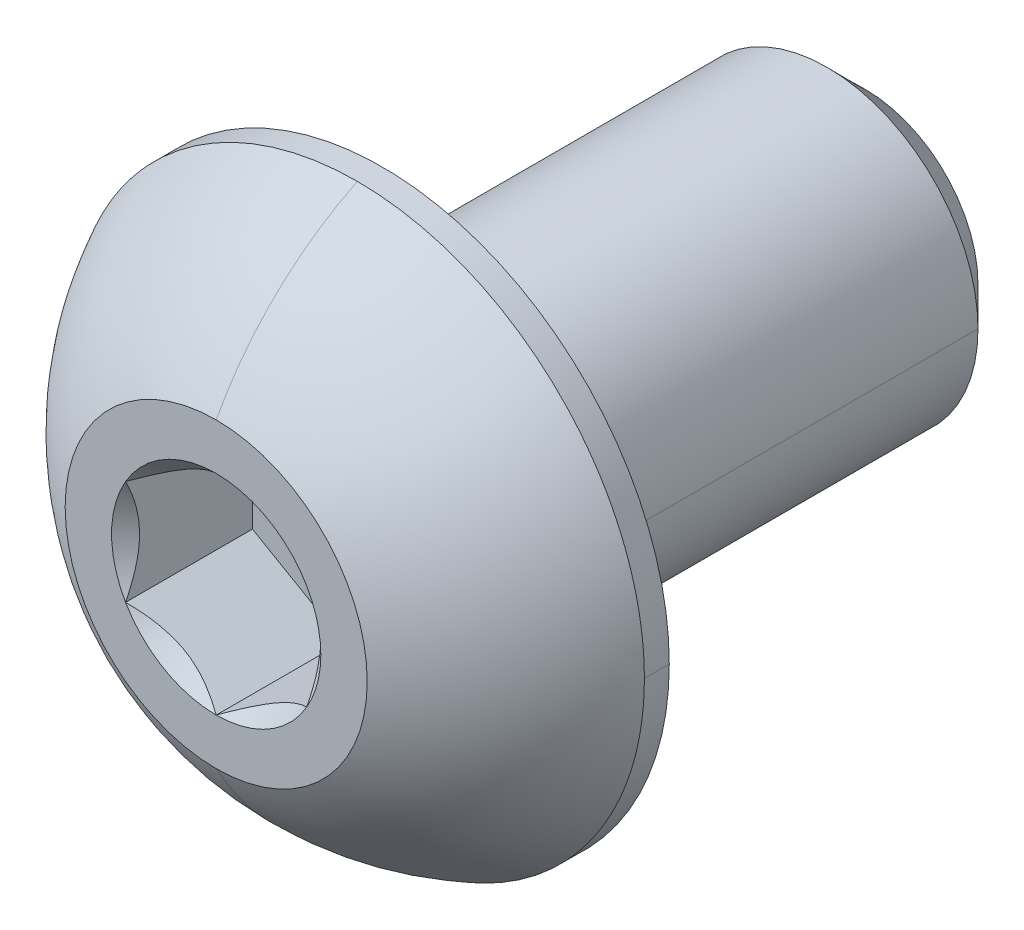
ISO-10303-21;
HEADER;
FILE_DESCRIPTION(('STEP AP214'),'2;1');
FILE_NAME('part.step','',(''),(''),'','','');
FILE_SCHEMA(('AUTOMOTIVE_DESIGN { 1 0 10303 214 1 1 1 1 }'));
ENDSEC;
DATA;
#1=APPLICATION_CONTEXT('core data for automotive mechanical design processes');
#2=APPLICATION_PROTOCOL_DEFINITION('international standard','automotive_design',2000,#1);
#3=PRODUCT_CONTEXT('',#1,'mechanical');
#4=PRODUCT('Part','Part','',(#3));
#5=PRODUCT_RELATED_PRODUCT_CATEGORY('part','',(#4));
#6=PRODUCT_DEFINITION_FORMATION('','',#4);
#7=PRODUCT_DEFINITION_CONTEXT('part definition',#1,'design');
#8=PRODUCT_DEFINITION('design','',#6,#7);
#9=PRODUCT_DEFINITION_SHAPE('','',#8);
#10=(LENGTH_UNIT() NAMED_UNIT(*) SI_UNIT(.MILLI.,.METRE.));
#11=(NAMED_UNIT(*) PLANE_ANGLE_UNIT() SI_UNIT($,.RADIAN.));
#12=(NAMED_UNIT(*) SI_UNIT($,.STERADIAN.) SOLID_ANGLE_UNIT());
#13=UNCERTAINTY_MEASURE_WITH_UNIT(LENGTH_MEASURE(1.E-05),#10,'distance_accuracy_value','');
#14=(GEOMETRIC_REPRESENTATION_CONTEXT(3) GLOBAL_UNCERTAINTY_ASSIGNED_CONTEXT((#13)) GLOBAL_UNIT_ASSIGNED_CONTEXT((#10,
#11,#12)) REPRESENTATION_CONTEXT('',''));
#15=CARTESIAN_POINT('',(0.,0.,0.));
#16=DIRECTION('',(0.,0.,1.));
#17=DIRECTION('',(1.,0.,0.));
#18=AXIS2_PLACEMENT_3D('',#15,#16,#17);
#19=CARTESIAN_POINT('',(1.5,0.866025403784439,3.275));
#20=DIRECTION('',(0.5,0.866025403784439,0.));
#21=DIRECTION('',(0.,0.,-1.));
#22=AXIS2_PLACEMENT_3D('',#19,#20,#21);
#23=PLANE('',#22);
#24=DIRECTION('',(0.,0.,1.));
#25=VECTOR('',#24,1.);
#26=CARTESIAN_POINT('',(1.5,0.866025403784439,3.275));
#27=LINE('',#26,#25);
#28=CARTESIAN_POINT('',(1.5,0.866025403784439,3.275));
#29=VERTEX_POINT('',#28);
#30=CARTESIAN_POINT('',(1.5,0.866025403784439,5.375));
#31=VERTEX_POINT('',#30);
#32=EDGE_CURVE('E10',#29,#31,#27,.T.);
#33=ORIENTED_EDGE('',*,*,#32,.T.);
#34=CARTESIAN_POINT('',(1.5,0.866025403784439,5.375));
#35=CARTESIAN_POINT('',(1.09983313244963,1.09706185248541,5.14396355129903));
#36=CARTESIAN_POINT('',(0.752762837135629,1.29744298091268,5.14295258499126));
#37=CARTESIAN_POINT('',(0.40367911573999,1.49898656143016,5.14193575386027));
#38=CARTESIAN_POINT('',(0.,1.73205080756888,5.375));
#39=B_SPLINE_CURVE_WITH_KNOTS('',2,(#34,#35,#36,#37,#38),.UNSPECIFIED.,.F.,.F.,(3,2,3),(0.,0.5,
1.),.UNSPECIFIED.);
#40=CARTESIAN_POINT('',(0.,1.73205080756888,5.375));
#41=VERTEX_POINT('',#40);
#42=EDGE_CURVE('E265',#31,#41,#39,.T.);
#43=ORIENTED_EDGE('',*,*,#42,.T.);
#44=DIRECTION('',(0.,0.,1.));
#45=VECTOR('',#44,1.);
#46=CARTESIAN_POINT('',(0.,1.73205080756888,3.275));
#47=LINE('',#46,#45);
#48=CARTESIAN_POINT('',(0.,1.73205080756888,3.275));
#49=VERTEX_POINT('',#48);
#50=EDGE_CURVE('E248',#49,#41,#47,.T.);
#51=ORIENTED_EDGE('',*,*,#50,.F.);
#52=DIRECTION('',(-0.866025403784439,0.5,0.));
#53=VECTOR('',#52,1.);
#54=CARTESIAN_POINT('',(1.5,0.866025403784439,3.275));
#55=LINE('',#54,#53);
#56=EDGE_CURVE('E261',#29,#49,#55,.T.);
#57=ORIENTED_EDGE('',*,*,#56,.F.);
#58=EDGE_LOOP('',(#33,#43,#51,#57));
#59=FACE_BOUND('',#58,.T.);
#60=ADVANCED_FACE('F16',(#59),#23,.F.);
#61=CARTESIAN_POINT('',(1.5,-0.866025403784439,3.275));
#62=DIRECTION('',(1.,0.,0.));
#63=DIRECTION('',(0.,-1.,0.));
#64=AXIS2_PLACEMENT_3D('',#61,#62,#63);
#65=PLANE('',#64);
#66=DIRECTION('',(0.,0.,1.));
#67=VECTOR('',#66,1.);
#68=CARTESIAN_POINT('',(1.5,-0.866025403784439,3.275));
#69=LINE('',#68,#67);
#70=CARTESIAN_POINT('',(1.5,-0.866025403784439,3.275));
#71=VERTEX_POINT('',#70);
#72=CARTESIAN_POINT('',(1.5,-0.866025403784439,5.375));
#73=VERTEX_POINT('',#72);
#74=EDGE_CURVE('E28',#71,#73,#69,.T.);
#75=ORIENTED_EDGE('',*,*,#74,.T.);
#76=CARTESIAN_POINT('',(1.5,-0.86602540378444,5.375));
#77=CARTESIAN_POINT('',(1.5,-0.646658602548751,5.26531659938216));
#78=CARTESIAN_POINT('',(1.5,-0.445863993413875,5.20781171055308));
#79=CARTESIAN_POINT('',(1.5,-0.219378137358918,5.14294919243113));
#80=CARTESIAN_POINT('',(1.5,0.,5.14294919243113));
#81=B_SPLINE_CURVE_WITH_KNOTS('',2,(#76,#77,#78,#79,#80),.UNSPECIFIED.,.F.,.F.,(3,2,3),(0.,0.5,
1.),.UNSPECIFIED.);
#82=CARTESIAN_POINT('',(1.5,0.,5.14294919243113));
#83=VERTEX_POINT('',#82);
#84=EDGE_CURVE('E450',#73,#83,#81,.T.);
#85=ORIENTED_EDGE('',*,*,#84,.T.);
#86=CARTESIAN_POINT('',(1.5,0.,5.14294919243113));
#87=CARTESIAN_POINT('',(1.5,0.217075978680325,5.14294919243113));
#88=CARTESIAN_POINT('',(1.5,0.445959967478607,5.20783905839392));
#89=CARTESIAN_POINT('',(1.5,0.643987045881716,5.26398082104864));
#90=CARTESIAN_POINT('',(1.5,0.866025403784441,5.375));
#91=B_SPLINE_CURVE_WITH_KNOTS('',2,(#86,#87,#88,#89,#90),.UNSPECIFIED.,.F.,.F.,(3,2,3),(0.,0.5,
1.),.UNSPECIFIED.);
#92=EDGE_CURVE('E423',#83,#31,#91,.T.);
#93=ORIENTED_EDGE('',*,*,#92,.T.);
#94=ORIENTED_EDGE('',*,*,#32,.F.);
#95=DIRECTION('',(0.,1.,0.));
#96=VECTOR('',#95,1.);
#97=CARTESIAN_POINT('',(1.5,-0.866025403784439,3.275));
#98=LINE('',#97,#96);
#99=EDGE_CURVE('E244',#71,#29,#98,.T.);
#100=ORIENTED_EDGE('',*,*,#99,.F.);
#101=EDGE_LOOP('',(#75,#85,#93,#94,#100));
#102=FACE_BOUND('',#101,.T.);
#103=ADVANCED_FACE('F404',(#102),#65,.F.);
#104=CARTESIAN_POINT('',(0.,-1.73205080756887,3.275));
#105=DIRECTION('',(0.5,-0.866025403784439,0.));
#106=DIRECTION('',(0.,0.,-1.));
#107=AXIS2_PLACEMENT_3D('',#104,#105,#106);
#108=PLANE('',#107);
#109=DIRECTION('',(0.,0.,1.));
#110=VECTOR('',#109,1.);
#111=CARTESIAN_POINT('',(0.,-1.73205080756887,3.275));
#112=LINE('',#111,#110);
#113=CARTESIAN_POINT('',(0.,-1.73205080756887,3.275));
#114=VERTEX_POINT('',#113);
#115=CARTESIAN_POINT('',(0.,-1.73205080756888,5.375));
#116=VERTEX_POINT('',#115);
#117=EDGE_CURVE('E52',#114,#116,#112,.T.);
#118=ORIENTED_EDGE('',*,*,#117,.T.);
#119=CARTESIAN_POINT('',(0.,-1.73205080756887,5.375));
#120=CARTESIAN_POINT('',(0.4001668675493,-1.50101435886852,5.14396355129965));
#121=CARTESIAN_POINT('',(0.74723716286437,-1.30063323044064,5.14295258499126));
#122=CARTESIAN_POINT('',(1.09632088425894,-1.09908964992377,5.14193575385965));
#123=CARTESIAN_POINT('',(1.5,-0.866025403784437,5.375));
#124=B_SPLINE_CURVE_WITH_KNOTS('',2,(#119,#120,#121,#122,#123),.UNSPECIFIED.,.F.,.F.,(3,2,3),
(0.,0.5,1.),.UNSPECIFIED.);
#125=EDGE_CURVE('E415',#116,#73,#124,.T.);
#126=ORIENTED_EDGE('',*,*,#125,.T.);
#127=ORIENTED_EDGE('',*,*,#74,.F.);
#128=DIRECTION('',(0.866025403784439,0.5,0.));
#129=VECTOR('',#128,1.);
#130=CARTESIAN_POINT('',(0.,-1.73205080756887,3.275));
#131=LINE('',#130,#129);
#132=EDGE_CURVE('E249',#114,#71,#131,.T.);
#133=ORIENTED_EDGE('',*,*,#132,.F.);
#134=EDGE_LOOP('',(#118,#126,#127,#133));
#135=FACE_BOUND('',#134,.T.);
#136=ADVANCED_FACE('F401',(#135),#108,.F.);
#137=CARTESIAN_POINT('',(-1.5,-0.866025403784438,3.275));
#138=DIRECTION('',(-0.5,-0.866025403784439,0.));
#139=DIRECTION('',(-0.866025403784439,0.5,0.));
#140=AXIS2_PLACEMENT_3D('',#137,#138,#139);
#141=PLANE('',#140);
#142=DIRECTION('',(0.,0.,1.));
#143=VECTOR('',#142,1.);
#144=CARTESIAN_POINT('',(-1.5,-0.866025403784438,3.275));
#145=LINE('',#144,#143);
#146=CARTESIAN_POINT('',(-1.5,-0.866025403784438,3.275));
#147=VERTEX_POINT('',#146);
#148=CARTESIAN_POINT('',(-1.5,-0.866025403784439,5.375));
#149=VERTEX_POINT('',#148);
#150=EDGE_CURVE('E376',#147,#149,#145,.T.);
#151=ORIENTED_EDGE('',*,*,#150,.T.);
#152=CARTESIAN_POINT('',(-1.5,-0.866025403784438,5.375));
#153=CARTESIAN_POINT('',(-1.09983313245018,-1.0970618524851,5.14396355129934));
#154=CARTESIAN_POINT('',(-0.752762837135629,-1.29744298091268,5.14295258499127));
#155=CARTESIAN_POINT('',(-0.403679115740522,-1.49898656142986,5.14193575385996));
#156=CARTESIAN_POINT('',(0.,-1.73205080756888,5.375));
#157=B_SPLINE_CURVE_WITH_KNOTS('',2,(#152,#153,#154,#155,#156),.UNSPECIFIED.,.F.,.F.,(3,2,3),
(0.,0.5,1.),.UNSPECIFIED.);
#158=EDGE_CURVE('E387',#149,#116,#157,.T.);
#159=ORIENTED_EDGE('',*,*,#158,.T.);
#160=ORIENTED_EDGE('',*,*,#117,.F.);
#161=DIRECTION('',(0.866025403784439,-0.5,0.));
#162=VECTOR('',#161,1.);
#163=CARTESIAN_POINT('',(-1.5,-0.866025403784438,3.275));
#164=LINE('',#163,#162);
#165=EDGE_CURVE('E254',#147,#114,#164,.T.);
#166=ORIENTED_EDGE('',*,*,#165,.F.);
#167=EDGE_LOOP('',(#151,#159,#160,#166));
#168=FACE_BOUND('',#167,.T.);
#169=ADVANCED_FACE('F392',(#168),#141,.F.);
#170=CARTESIAN_POINT('',(-1.5,0.866025403784439,3.275));
#171=DIRECTION('',(-1.,0.,0.));
#172=DIRECTION('',(0.,0.,1.));
#173=AXIS2_PLACEMENT_3D('',#170,#171,#172);
#174=PLANE('',#173);
#175=DIRECTION('',(0.,0.,1.));
#176=VECTOR('',#175,1.);
#177=CARTESIAN_POINT('',(-1.5,0.866025403784439,3.275));
#178=LINE('',#177,#176);
#179=CARTESIAN_POINT('',(-1.5,0.866025403784439,3.275));
#180=VERTEX_POINT('',#179);
#181=CARTESIAN_POINT('',(-1.5,0.866025403784439,5.375));
#182=VERTEX_POINT('',#181);
#183=EDGE_CURVE('E470',#180,#182,#178,.T.);
#184=ORIENTED_EDGE('',*,*,#183,.T.);
#185=CARTESIAN_POINT('',(-1.5,0.866025403784439,5.375));
#186=CARTESIAN_POINT('',(-1.5,0.645653699099227,5.2648141476574));
#187=CARTESIAN_POINT('',(-1.5,0.446004889099508,5.20785186068247));
#188=CARTESIAN_POINT('',(-1.5,0.218857206002137,5.14304380342282));
#189=CARTESIAN_POINT('',(-1.5,9.44212914030925E-05,5.14294919540291));
#190=CARTESIAN_POINT('',(-1.5,-0.217614156110549,5.1428550432945));
#191=CARTESIAN_POINT('',(-1.5,-0.445819185272561,5.20779894431054));
#192=CARTESIAN_POINT('',(-1.5,-0.644979895375046,5.2644772457953));
#193=CARTESIAN_POINT('',(-1.5,-0.866025403784441,5.375));
#194=B_SPLINE_CURVE_WITH_KNOTS('',2,(#185,#186,#187,#188,#189,#190,#191,#192,#193),
.UNSPECIFIED.,.F.,.F.,(3,2,2,2,3),(0.,0.25,0.5,0.75,1.),.UNSPECIFIED.);
#195=EDGE_CURVE('E504',#182,#149,#194,.T.);
#196=ORIENTED_EDGE('',*,*,#195,.T.);
#197=ORIENTED_EDGE('',*,*,#150,.F.);
#198=DIRECTION('',(0.,-1.,0.));
#199=VECTOR('',#198,1.);
#200=CARTESIAN_POINT('',(-1.5,0.866025403784439,3.275));
#201=LINE('',#200,#199);
#202=EDGE_CURVE('E250',#180,#147,#201,.T.);
#203=ORIENTED_EDGE('',*,*,#202,.F.);
#204=EDGE_LOOP('',(#184,#196,#197,#203));
#205=FACE_BOUND('',#204,.T.);
#206=ADVANCED_FACE('F317',(#205),#174,.F.);
#207=CARTESIAN_POINT('',(0.,1.73205080756888,3.275));
#208=DIRECTION('',(-0.5,0.866025403784439,0.));
#209=DIRECTION('',(0.,0.,1.));
#210=AXIS2_PLACEMENT_3D('',#207,#208,#209);
#211=PLANE('',#210);
#212=ORIENTED_EDGE('',*,*,#50,.T.);
#213=CARTESIAN_POINT('',(0.,1.73205080756888,5.375));
#214=CARTESIAN_POINT('',(-0.400166867550903,1.5010143588676,5.14396355129872));
#215=CARTESIAN_POINT('',(-0.747237162864371,1.30063323044064,5.14295258499126));
#216=CARTESIAN_POINT('',(-1.09632088426054,1.09908964992285,5.14193575386057));
#217=CARTESIAN_POINT('',(-1.5,0.866025403784442,5.375));
#218=B_SPLINE_CURVE_WITH_KNOTS('',2,(#213,#214,#215,#216,#217),.UNSPECIFIED.,.F.,.F.,(3,2,3),
(0.,0.5,1.),.UNSPECIFIED.);
#219=EDGE_CURVE('E219',#41,#182,#218,.T.);
#220=ORIENTED_EDGE('',*,*,#219,.T.);
#221=ORIENTED_EDGE('',*,*,#183,.F.);
#222=DIRECTION('',(-0.866025403784439,-0.5,0.));
#223=VECTOR('',#222,1.);
#224=CARTESIAN_POINT('',(0.,1.73205080756888,3.275));
#225=LINE('',#224,#223);
#226=EDGE_CURVE('E255',#49,#180,#225,.T.);
#227=ORIENTED_EDGE('',*,*,#226,.F.);
#228=EDGE_LOOP('',(#212,#220,#221,#227));
#229=FACE_BOUND('',#228,.T.);
#230=ADVANCED_FACE('F312',(#229),#211,.F.);
#231=CARTESIAN_POINT('',(0.,0.,3.275));
#232=DIRECTION('',(0.,0.,1.));
#233=DIRECTION('',(1.,0.,0.));
#234=AXIS2_PLACEMENT_3D('',#231,#232,#233);
#235=PLANE('',#234);
#236=ORIENTED_EDGE('',*,*,#56,.T.);
#237=ORIENTED_EDGE('',*,*,#226,.T.);
#238=ORIENTED_EDGE('',*,*,#202,.T.);
#239=ORIENTED_EDGE('',*,*,#165,.T.);
#240=ORIENTED_EDGE('',*,*,#132,.T.);
#241=ORIENTED_EDGE('',*,*,#99,.T.);
#242=EDGE_LOOP('',(#236,#237,#238,#239,#240,#241));
#243=FACE_BOUND('',#242,.T.);
#244=ADVANCED_FACE('F307',(#243),#235,.T.);
#245=CARTESIAN_POINT('',(0.,0.,5.375));
#246=DIRECTION('',(0.,0.,1.));
#247=DIRECTION('',(1.,0.,0.));
#248=AXIS2_PLACEMENT_3D('',#245,#246,#247);
#249=CONICAL_SURFACE('',#248,1.73205080756888,0.78539816339745);
#250=CARTESIAN_POINT('',(0.,0.,5.375));
#251=DIRECTION('',(0.,0.,1.));
#252=DIRECTION('',(1.,0.,0.));
#253=AXIS2_PLACEMENT_3D('',#250,#251,#252);
#254=CIRCLE('',#253,1.73205080756888);
#255=EDGE_CURVE('E429',#31,#41,#254,.T.);
#256=ORIENTED_EDGE('',*,*,#255,.T.);
#257=ORIENTED_EDGE('',*,*,#42,.F.);
#258=EDGE_LOOP('',(#256,#257));
#259=FACE_BOUND('',#258,.T.);
#260=ADVANCED_FACE('F296',(#259),#249,.F.);
#261=CARTESIAN_POINT('',(0.,0.,5.375));
#262=DIRECTION('',(0.,0.,1.));
#263=DIRECTION('',(1.,0.,0.));
#264=AXIS2_PLACEMENT_3D('',#261,#262,#263);
#265=CONICAL_SURFACE('',#264,1.73205080756888,0.78539816339745);
#266=DIRECTION('',(0.707106781186549,0.,0.707106781186546));
#267=VECTOR('',#266,1.);
#268=CARTESIAN_POINT('',(1.73205080756888,0.,5.375));
#269=LINE('',#268,#267);
#270=CARTESIAN_POINT('',(1.73205080756888,0.,5.375));
#271=VERTEX_POINT('',#270);
#272=EDGE_CURVE('E419',#83,#271,#269,.T.);
#273=ORIENTED_EDGE('',*,*,#272,.F.);
#274=ORIENTED_EDGE('',*,*,#84,.F.);
#275=CARTESIAN_POINT('',(0.,0.,5.375));
#276=DIRECTION('',(0.,0.,1.));
#277=DIRECTION('',(1.,0.,0.));
#278=AXIS2_PLACEMENT_3D('',#275,#276,#277);
#279=CIRCLE('',#278,1.73205080756888);
#280=EDGE_CURVE('E426',#73,#271,#279,.T.);
#281=ORIENTED_EDGE('',*,*,#280,.T.);
#282=EDGE_LOOP('',(#273,#274,#281));
#283=FACE_BOUND('',#282,.T.);
#284=ADVANCED_FACE('F306',(#283),#265,.F.);
#285=CARTESIAN_POINT('',(0.,0.,5.375));
#286=DIRECTION('',(0.,0.,1.));
#287=DIRECTION('',(1.,0.,0.));
#288=AXIS2_PLACEMENT_3D('',#285,#286,#287);
#289=CONICAL_SURFACE('',#288,1.73205080756888,0.78539816339745);
#290=CARTESIAN_POINT('',(0.,0.,5.375));
#291=DIRECTION('',(0.,0.,1.));
#292=DIRECTION('',(1.,0.,0.));
#293=AXIS2_PLACEMENT_3D('',#290,#291,#292);
#294=CIRCLE('',#293,1.73205080756888);
#295=EDGE_CURVE('E382',#116,#73,#294,.T.);
#296=ORIENTED_EDGE('',*,*,#295,.T.);
#297=ORIENTED_EDGE('',*,*,#125,.F.);
#298=EDGE_LOOP('',(#296,#297));
#299=FACE_BOUND('',#298,.T.);
#300=ADVANCED_FACE('F355',(#299),#289,.F.);
#301=CARTESIAN_POINT('',(0.,0.,5.375));
#302=DIRECTION('',(0.,0.,1.));
#303=DIRECTION('',(1.,0.,0.));
#304=AXIS2_PLACEMENT_3D('',#301,#302,#303);
#305=CONICAL_SURFACE('',#304,1.73205080756888,0.78539816339745);
#306=CARTESIAN_POINT('',(0.,0.,5.375));
#307=DIRECTION('',(0.,0.,1.));
#308=DIRECTION('',(1.,0.,0.));
#309=AXIS2_PLACEMENT_3D('',#306,#307,#308);
#310=CIRCLE('',#309,1.73205080756888);
#311=EDGE_CURVE('E257',#149,#116,#310,.T.);
#312=ORIENTED_EDGE('',*,*,#311,.T.);
#313=ORIENTED_EDGE('',*,*,#158,.F.);
#314=EDGE_LOOP('',(#312,#313));
#315=FACE_BOUND('',#314,.T.);
#316=ADVANCED_FACE('F359',(#315),#305,.F.);
#317=CARTESIAN_POINT('',(0.,0.,5.375));
#318=DIRECTION('',(0.,0.,1.));
#319=DIRECTION('',(1.,0.,0.));
#320=AXIS2_PLACEMENT_3D('',#317,#318,#319);
#321=CONICAL_SURFACE('',#320,1.73205080756888,0.78539816339745);
#322=CARTESIAN_POINT('',(0.,0.,5.375));
#323=DIRECTION('',(0.,0.,1.));
#324=DIRECTION('',(1.,0.,0.));
#325=AXIS2_PLACEMENT_3D('',#322,#323,#324);
#326=CIRCLE('',#325,1.73205080756888);
#327=EDGE_CURVE('E243',#182,#149,#326,.T.);
#328=ORIENTED_EDGE('',*,*,#327,.T.);
#329=ORIENTED_EDGE('',*,*,#195,.F.);
#330=EDGE_LOOP('',(#328,#329));
#331=FACE_BOUND('',#330,.T.);
#332=ADVANCED_FACE('F353',(#331),#321,.F.);
#333=CARTESIAN_POINT('',(0.,0.,5.375));
#334=DIRECTION('',(0.,0.,1.));
#335=DIRECTION('',(1.,0.,0.));
#336=AXIS2_PLACEMENT_3D('',#333,#334,#335);
#337=CONICAL_SURFACE('',#336,1.73205080756888,0.78539816339745);
#338=CARTESIAN_POINT('',(0.,0.,5.375));
#339=DIRECTION('',(0.,0.,1.));
#340=DIRECTION('',(1.,0.,0.));
#341=AXIS2_PLACEMENT_3D('',#338,#339,#340);
#342=CIRCLE('',#341,1.73205080756888);
#343=EDGE_CURVE('E463',#41,#182,#342,.T.);
#344=ORIENTED_EDGE('',*,*,#343,.T.);
#345=ORIENTED_EDGE('',*,*,#219,.F.);
#346=EDGE_LOOP('',(#344,#345));
#347=FACE_BOUND('',#346,.T.);
#348=ADVANCED_FACE('F342',(#347),#337,.F.);
#349=CARTESIAN_POINT('',(0.,0.,-5.375));
#350=DIRECTION('',(0.,0.,1.));
#351=DIRECTION('',(1.,0.,0.));
#352=AXIS2_PLACEMENT_3D('',#349,#350,#351);
#353=PLANE('',#352);
#354=CARTESIAN_POINT('',(0.,0.,-5.375));
#355=DIRECTION('',(0.,0.,1.));
#356=DIRECTION('',(1.,0.,0.));
#357=AXIS2_PLACEMENT_3D('',#354,#355,#356);
#358=CIRCLE('',#357,1.86);
#359=CARTESIAN_POINT('',(1.86,0.,-5.375));
#360=VERTEX_POINT('',#359);
#361=CARTESIAN_POINT('',(-1.86,0.,-5.375));
#362=VERTEX_POINT('',#361);
#363=EDGE_CURVE('E196',#360,#362,#358,.T.);
#364=ORIENTED_EDGE('',*,*,#363,.F.);
#365=CARTESIAN_POINT('',(0.,0.,-5.375));
#366=DIRECTION('',(0.,0.,1.));
#367=DIRECTION('',(1.,0.,0.));
#368=AXIS2_PLACEMENT_3D('',#365,#366,#367);
#369=CIRCLE('',#368,1.86);
#370=EDGE_CURVE('E216',#362,#360,#369,.T.);
#371=ORIENTED_EDGE('',*,*,#370,.F.);
#372=EDGE_LOOP('',(#364,#371));
#373=FACE_BOUND('',#372,.T.);
#374=ADVANCED_FACE('F352',(#373),#353,.F.);
#375=CARTESIAN_POINT('',(0.,0.,-5.375));
#376=DIRECTION('',(0.,0.,1.));
#377=DIRECTION('',(1.,0.,0.));
#378=AXIS2_PLACEMENT_3D('',#375,#376,#377);
#379=CONICAL_SURFACE('',#378,1.86,0.785398163397442);
#380=DIRECTION('',(-0.707106781186544,0.,0.707106781186552));
#381=VECTOR('',#380,1.);
#382=CARTESIAN_POINT('',(-1.86,0.,-5.375));
#383=LINE('',#382,#381);
#384=CARTESIAN_POINT('',(-2.5,0.,-4.735));
#385=VERTEX_POINT('',#384);
#386=EDGE_CURVE('E199',#362,#385,#383,.T.);
#387=ORIENTED_EDGE('',*,*,#386,.F.);
#388=ORIENTED_EDGE('',*,*,#370,.T.);
#389=DIRECTION('',(0.707106781186544,0.,0.707106781186552));
#390=VECTOR('',#389,1.);
#391=CARTESIAN_POINT('',(1.86,0.,-5.375));
#392=LINE('',#391,#390);
#393=CARTESIAN_POINT('',(2.5,0.,-4.735));
#394=VERTEX_POINT('',#393);
#395=EDGE_CURVE('E194',#360,#394,#392,.T.);
#396=ORIENTED_EDGE('',*,*,#395,.T.);
#397=CARTESIAN_POINT('',(0.,0.,-4.735));
#398=DIRECTION('',(0.,0.,1.));
#399=DIRECTION('',(1.,0.,0.));
#400=AXIS2_PLACEMENT_3D('',#397,#398,#399);
#401=CIRCLE('',#400,2.5);
#402=EDGE_CURVE('E211',#385,#394,#401,.T.);
#403=ORIENTED_EDGE('',*,*,#402,.F.);
#404=EDGE_LOOP('',(#387,#388,#396,#403));
#405=FACE_BOUND('',#404,.T.);
#406=ADVANCED_FACE('F764',(#405),#379,.T.);
#407=CARTESIAN_POINT('',(0.,0.,5.375));
#408=DIRECTION('',(0.,0.,1.));
#409=DIRECTION('',(1.,0.,0.));
#410=AXIS2_PLACEMENT_3D('',#407,#408,#409);
#411=CYLINDRICAL_SURFACE('',#410,2.5);
#412=DIRECTION('',(0.,0.,1.));
#413=VECTOR('',#412,1.);
#414=CARTESIAN_POINT('',(-2.5,0.,5.375));
#415=LINE('',#414,#413);
#416=CARTESIAN_POINT('',(-2.5,0.,2.625));
#417=VERTEX_POINT('',#416);
#418=EDGE_CURVE('E212',#385,#417,#415,.T.);
#419=ORIENTED_EDGE('',*,*,#418,.F.);
#420=ORIENTED_EDGE('',*,*,#402,.T.);
#421=DIRECTION('',(0.,0.,1.));
#422=VECTOR('',#421,1.);
#423=CARTESIAN_POINT('',(2.5,0.,5.375));
#424=LINE('',#423,#422);
#425=CARTESIAN_POINT('',(2.5,0.,2.625));
#426=VERTEX_POINT('',#425);
#427=EDGE_CURVE('E184',#394,#426,#424,.T.);
#428=ORIENTED_EDGE('',*,*,#427,.T.);
#429=CARTESIAN_POINT('',(0.,0.,2.625));
#430=DIRECTION('',(0.,0.,1.));
#431=DIRECTION('',(1.,0.,0.));
#432=AXIS2_PLACEMENT_3D('',#429,#430,#431);
#433=CIRCLE('',#432,2.5);
#434=EDGE_CURVE('E166',#417,#426,#433,.T.);
#435=ORIENTED_EDGE('',*,*,#434,.F.);
#436=EDGE_LOOP('',(#419,#420,#428,#435));
#437=FACE_BOUND('',#436,.T.);
#438=ADVANCED_FACE('F759',(#437),#411,.T.);
#439=CARTESIAN_POINT('',(0.,2.5,2.625));
#440=DIRECTION('',(0.,0.,1.));
#441=DIRECTION('',(1.,0.,0.));
#442=AXIS2_PLACEMENT_3D('',#439,#440,#441);
#443=PLANE('',#442);
#444=CARTESIAN_POINT('',(0.,0.,2.625));
#445=DIRECTION('',(0.,0.,1.));
#446=DIRECTION('',(1.,0.,0.));
#447=AXIS2_PLACEMENT_3D('',#444,#445,#446);
#448=CIRCLE('',#447,2.5);
#449=EDGE_CURVE('E190',#426,#417,#448,.T.);
#450=ORIENTED_EDGE('',*,*,#449,.T.);
#451=ORIENTED_EDGE('',*,*,#434,.T.);
#452=EDGE_LOOP('',(#450,#451));
#453=FACE_BOUND('',#452,.T.);
#454=CARTESIAN_POINT('',(0.,0.,2.625));
#455=DIRECTION('',(0.,0.,1.));
#456=DIRECTION('',(1.,0.,0.));
#457=AXIS2_PLACEMENT_3D('',#454,#455,#456);
#458=CIRCLE('',#457,4.75);
#459=CARTESIAN_POINT('',(4.75,0.,2.625));
#460=VERTEX_POINT('',#459);
#461=CARTESIAN_POINT('',(-4.75,0.,2.625));
#462=VERTEX_POINT('',#461);
#463=EDGE_CURVE('E161',#460,#462,#458,.T.);
#464=ORIENTED_EDGE('',*,*,#463,.F.);
#465=CARTESIAN_POINT('',(0.,0.,2.625));
#466=DIRECTION('',(0.,0.,1.));
#467=DIRECTION('',(1.,0.,0.));
#468=AXIS2_PLACEMENT_3D('',#465,#466,#467);
#469=CIRCLE('',#468,4.75);
#470=EDGE_CURVE('E157',#462,#460,#469,.T.);
#471=ORIENTED_EDGE('',*,*,#470,.F.);
#472=EDGE_LOOP('',(#464,#471));
#473=FACE_BOUND('',#472,.T.);
#474=ADVANCED_FACE('F159',(#453,#473),#443,.F.);
#475=CARTESIAN_POINT('',(0.,0.,5.375));
#476=DIRECTION('',(0.,0.,1.));
#477=DIRECTION('',(1.,0.,0.));
#478=AXIS2_PLACEMENT_3D('',#475,#476,#477);
#479=CYLINDRICAL_SURFACE('',#478,4.75);
#480=DIRECTION('',(0.,0.,1.));
#481=VECTOR('',#480,1.);
#482=CARTESIAN_POINT('',(-4.75,0.,5.375));
#483=LINE('',#482,#481);
#484=CARTESIAN_POINT('',(-4.75,0.,3.0375));
#485=VERTEX_POINT('',#484);
#486=EDGE_CURVE('E170',#462,#485,#483,.T.);
#487=ORIENTED_EDGE('',*,*,#486,.F.);
#488=ORIENTED_EDGE('',*,*,#470,.T.);
#489=DIRECTION('',(0.,0.,1.));
#490=VECTOR('',#489,1.);
#491=CARTESIAN_POINT('',(4.75,0.,5.375));
#492=LINE('',#491,#490);
#493=CARTESIAN_POINT('',(4.75,0.,3.0375));
#494=VERTEX_POINT('',#493);
#495=EDGE_CURVE('E182',#460,#494,#492,.T.);
#496=ORIENTED_EDGE('',*,*,#495,.T.);
#497=CARTESIAN_POINT('',(0.,0.,3.0375));
#498=DIRECTION('',(0.,0.,1.));
#499=DIRECTION('',(1.,0.,0.));
#500=AXIS2_PLACEMENT_3D('',#497,#498,#499);
#501=CIRCLE('',#500,4.75);
#502=CARTESIAN_POINT('',(0.,-4.75,3.0375));
#503=VERTEX_POINT('',#502);
#504=EDGE_CURVE('E167',#503,#494,#501,.T.);
#505=ORIENTED_EDGE('',*,*,#504,.F.);
#506=CARTESIAN_POINT('',(0.,0.,3.0375));
#507=DIRECTION('',(0.,0.,1.));
#508=DIRECTION('',(1.,0.,0.));
#509=AXIS2_PLACEMENT_3D('',#506,#507,#508);
#510=CIRCLE('',#509,4.75);
#511=EDGE_CURVE('E173',#485,#503,#510,.T.);
#512=ORIENTED_EDGE('',*,*,#511,.F.);
#513=EDGE_LOOP('',(#487,#488,#496,#505,#512));
#514=FACE_BOUND('',#513,.T.);
#515=ADVANCED_FACE('F171',(#514),#479,.T.);
#516=CARTESIAN_POINT('',(0.,0.,0.71694518716578));
#517=DIRECTION('',(-1.,0.,0.));
#518=DIRECTION('',(0.,1.,0.));
#519=AXIS2_PLACEMENT_3D('',#516,#517,#518);
#520=SPHERICAL_SURFACE('',#519,5.28653711226622);
#521=CARTESIAN_POINT('',(0.,0.,0.71694518716578));
#522=DIRECTION('',(-1.,0.,0.));
#523=DIRECTION('',(0.,-1.,0.));
#524=AXIS2_PLACEMENT_3D('',#521,#522,#523);
#525=CIRCLE('',#524,5.28653711226622);
#526=CARTESIAN_POINT('',(0.,-2.5,5.375));
#527=VERTEX_POINT('',#526);
#528=EDGE_CURVE('E228',#503,#527,#525,.T.);
#529=ORIENTED_EDGE('',*,*,#528,.F.);
#530=ORIENTED_EDGE('',*,*,#504,.T.);
#531=CARTESIAN_POINT('',(0.,0.,3.0375));
#532=DIRECTION('',(0.,0.,1.));
#533=DIRECTION('',(1.,0.,0.));
#534=AXIS2_PLACEMENT_3D('',#531,#532,#533);
#535=CIRCLE('',#534,4.75);
#536=CARTESIAN_POINT('',(0.,4.75,3.0375));
#537=VERTEX_POINT('',#536);
#538=EDGE_CURVE('E225',#494,#537,#535,.T.);
#539=ORIENTED_EDGE('',*,*,#538,.T.);
#540=CARTESIAN_POINT('',(0.,0.,0.71694518716578));
#541=DIRECTION('',(1.,0.,0.));
#542=DIRECTION('',(0.,0.,-1.));
#543=AXIS2_PLACEMENT_3D('',#540,#541,#542);
#544=CIRCLE('',#543,5.28653711226622);
#545=CARTESIAN_POINT('',(0.,2.5,5.375));
#546=VERTEX_POINT('',#545);
#547=EDGE_CURVE('E236',#537,#546,#544,.T.);
#548=ORIENTED_EDGE('',*,*,#547,.T.);
#549=CARTESIAN_POINT('',(0.,0.,5.375));
#550=DIRECTION('',(0.,0.,1.));
#551=DIRECTION('',(1.,0.,0.));
#552=AXIS2_PLACEMENT_3D('',#549,#550,#551);
#553=CIRCLE('',#552,2.5);
#554=EDGE_CURVE('E240',#527,#546,#553,.T.);
#555=ORIENTED_EDGE('',*,*,#554,.F.);
#556=EDGE_LOOP('',(#529,#530,#539,#548,#555));
#557=FACE_BOUND('',#556,.T.);
#558=ADVANCED_FACE('F741',(#557),#520,.T.);
#559=CARTESIAN_POINT('',(0.,0.,5.375));
#560=DIRECTION('',(0.,0.,-1.));
#561=DIRECTION('',(0.,-1.,0.));
#562=AXIS2_PLACEMENT_3D('',#559,#560,#561);
#563=PLANE('',#562);
#564=ORIENTED_EDGE('',*,*,#327,.F.);
#565=ORIENTED_EDGE('',*,*,#343,.F.);
#566=ORIENTED_EDGE('',*,*,#255,.F.);
#567=CARTESIAN_POINT('',(0.,0.,5.375));
#568=DIRECTION('',(0.,0.,1.));
#569=DIRECTION('',(1.,0.,0.));
#570=AXIS2_PLACEMENT_3D('',#567,#568,#569);
#571=CIRCLE('',#570,1.73205080756888);
#572=EDGE_CURVE('E200',#271,#31,#571,.T.);
#573=ORIENTED_EDGE('',*,*,#572,.F.);
#574=ORIENTED_EDGE('',*,*,#280,.F.);
#575=ORIENTED_EDGE('',*,*,#295,.F.);
#576=ORIENTED_EDGE('',*,*,#311,.F.);
#577=EDGE_LOOP('',(#564,#565,#566,#573,#574,#575,#576));
#578=FACE_BOUND('',#577,.T.);
#579=CARTESIAN_POINT('',(0.,0.,5.375));
#580=DIRECTION('',(0.,0.,1.));
#581=DIRECTION('',(1.,0.,0.));
#582=AXIS2_PLACEMENT_3D('',#579,#580,#581);
#583=CIRCLE('',#582,2.5);
#584=EDGE_CURVE('E232',#546,#527,#583,.T.);
#585=ORIENTED_EDGE('',*,*,#584,.T.);
#586=ORIENTED_EDGE('',*,*,#554,.T.);
#587=EDGE_LOOP('',(#585,#586));
#588=FACE_BOUND('',#587,.T.);
#589=ADVANCED_FACE('F485',(#578,#588),#563,.F.);
#590=CARTESIAN_POINT('',(0.,0.,0.71694518716578));
#591=DIRECTION('',(-1.,0.,0.));
#592=DIRECTION('',(0.,1.,0.));
#593=AXIS2_PLACEMENT_3D('',#590,#591,#592);
#594=SPHERICAL_SURFACE('',#593,5.28653711226622);
#595=CARTESIAN_POINT('',(0.,0.,3.0375));
#596=DIRECTION('',(0.,0.,1.));
#597=DIRECTION('',(1.,0.,0.));
#598=AXIS2_PLACEMENT_3D('',#595,#596,#597);
#599=CIRCLE('',#598,4.75);
#600=EDGE_CURVE('E178',#537,#485,#599,.T.);
#601=ORIENTED_EDGE('',*,*,#600,.T.);
#602=ORIENTED_EDGE('',*,*,#511,.T.);
#603=ORIENTED_EDGE('',*,*,#528,.T.);
#604=ORIENTED_EDGE('',*,*,#584,.F.);
#605=ORIENTED_EDGE('',*,*,#547,.F.);
#606=EDGE_LOOP('',(#601,#602,#603,#604,#605));
#607=FACE_BOUND('',#606,.T.);
#608=ADVANCED_FACE('F744',(#607),#594,.T.);
#609=CARTESIAN_POINT('',(0.,0.,5.375));
#610=DIRECTION('',(0.,0.,1.));
#611=DIRECTION('',(1.,0.,0.));
#612=AXIS2_PLACEMENT_3D('',#609,#610,#611);
#613=CYLINDRICAL_SURFACE('',#612,4.75);
#614=ORIENTED_EDGE('',*,*,#463,.T.);
#615=ORIENTED_EDGE('',*,*,#486,.T.);
#616=ORIENTED_EDGE('',*,*,#600,.F.);
#617=ORIENTED_EDGE('',*,*,#538,.F.);
#618=ORIENTED_EDGE('',*,*,#495,.F.);
#619=EDGE_LOOP('',(#614,#615,#616,#617,#618));
#620=FACE_BOUND('',#619,.T.);
#621=ADVANCED_FACE('F180',(#620),#613,.T.);
#622=CARTESIAN_POINT('',(0.,0.,5.375));
#623=DIRECTION('',(0.,0.,1.));
#624=DIRECTION('',(1.,0.,0.));
#625=AXIS2_PLACEMENT_3D('',#622,#623,#624);
#626=CYLINDRICAL_SURFACE('',#625,2.5);
#627=CARTESIAN_POINT('',(0.,0.,-4.735));
#628=DIRECTION('',(0.,0.,1.));
#629=DIRECTION('',(1.,0.,0.));
#630=AXIS2_PLACEMENT_3D('',#627,#628,#629);
#631=CIRCLE('',#630,2.5);
#632=EDGE_CURVE('E205',#394,#385,#631,.T.);
#633=ORIENTED_EDGE('',*,*,#632,.T.);
#634=ORIENTED_EDGE('',*,*,#418,.T.);
#635=ORIENTED_EDGE('',*,*,#449,.F.);
#636=ORIENTED_EDGE('',*,*,#427,.F.);
#637=EDGE_LOOP('',(#633,#634,#635,#636));
#638=FACE_BOUND('',#637,.T.);
#639=ADVANCED_FACE('F770',(#638),#626,.T.);
#640=CARTESIAN_POINT('',(0.,0.,-5.375));
#641=DIRECTION('',(0.,0.,1.));
#642=DIRECTION('',(1.,0.,0.));
#643=AXIS2_PLACEMENT_3D('',#640,#641,#642);
#644=CONICAL_SURFACE('',#643,1.86,0.785398163397442);
#645=ORIENTED_EDGE('',*,*,#363,.T.);
#646=ORIENTED_EDGE('',*,*,#386,.T.);
#647=ORIENTED_EDGE('',*,*,#632,.F.);
#648=ORIENTED_EDGE('',*,*,#395,.F.);
#649=EDGE_LOOP('',(#645,#646,#647,#648));
#650=FACE_BOUND('',#649,.T.);
#651=ADVANCED_FACE('F777',(#650),#644,.T.);
#652=CARTESIAN_POINT('',(0.,0.,5.375));
#653=DIRECTION('',(0.,0.,1.));
#654=DIRECTION('',(1.,0.,0.));
#655=AXIS2_PLACEMENT_3D('',#652,#653,#654);
#656=CONICAL_SURFACE('',#655,1.73205080756888,0.78539816339745);
#657=ORIENTED_EDGE('',*,*,#92,.F.);
#658=ORIENTED_EDGE('',*,*,#272,.T.);
#659=ORIENTED_EDGE('',*,*,#572,.T.);
#660=EDGE_LOOP('',(#657,#658,#659));
#661=FACE_BOUND('',#660,.T.);
#662=ADVANCED_FACE('F791',(#661),#656,.F.);
#663=CLOSED_SHELL('',(#60,#103,#136,#169,#206,#230,#244,#260,#284,#300,#316,#332,#348,#374,#406,
#438,#474,#515,#558,#589,#608,#621,#639,#651,#662));
#664=MANIFOLD_SOLID_BREP('B1',#663);
#665=ADVANCED_BREP_SHAPE_REPRESENTATION('',(#18,#664),#14);
#666=SHAPE_DEFINITION_REPRESENTATION(#9,#665);
ENDSEC;
END-ISO-10303-21;
